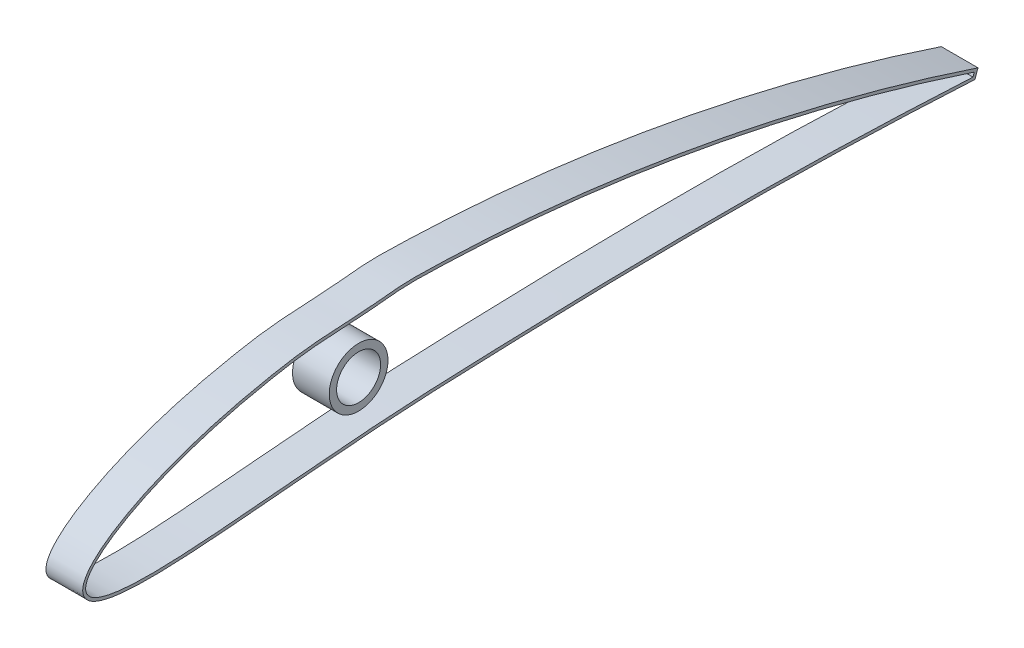
ISO-10303-21;
HEADER;
FILE_DESCRIPTION(('STEP AP214'),'2;1');
FILE_NAME('part.step','',(''),(''),'','','');
FILE_SCHEMA(('AUTOMOTIVE_DESIGN { 1 0 10303 214 1 1 1 1 }'));
ENDSEC;
DATA;
#1=APPLICATION_CONTEXT('core data for automotive mechanical design processes');
#2=APPLICATION_PROTOCOL_DEFINITION('international standard','automotive_design',2000,#1);
#3=PRODUCT_CONTEXT('',#1,'mechanical');
#4=PRODUCT('Part','Part','',(#3));
#5=PRODUCT_RELATED_PRODUCT_CATEGORY('part','',(#4));
#6=PRODUCT_DEFINITION_FORMATION('','',#4);
#7=PRODUCT_DEFINITION_CONTEXT('part definition',#1,'design');
#8=PRODUCT_DEFINITION('design','',#6,#7);
#9=PRODUCT_DEFINITION_SHAPE('','',#8);
#10=(LENGTH_UNIT() NAMED_UNIT(*) SI_UNIT(.MILLI.,.METRE.));
#11=(NAMED_UNIT(*) PLANE_ANGLE_UNIT() SI_UNIT($,.RADIAN.));
#12=(NAMED_UNIT(*) SI_UNIT($,.STERADIAN.) SOLID_ANGLE_UNIT());
#13=UNCERTAINTY_MEASURE_WITH_UNIT(LENGTH_MEASURE(1.E-05),#10,'distance_accuracy_value','');
#14=(GEOMETRIC_REPRESENTATION_CONTEXT(3) GLOBAL_UNCERTAINTY_ASSIGNED_CONTEXT((#13)) GLOBAL_UNIT_ASSIGNED_CONTEXT((#10,
#11,#12)) REPRESENTATION_CONTEXT('',''));
#15=CARTESIAN_POINT('',(0.,0.,0.));
#16=DIRECTION('',(0.,0.,1.));
#17=DIRECTION('',(1.,0.,0.));
#18=AXIS2_PLACEMENT_3D('',#15,#16,#17);
#19=CARTESIAN_POINT('',(5.,13.8316382788743,0.));
#20=DIRECTION('',(1.,0.,0.));
#21=DIRECTION('',(0.,0.,-1.));
#22=AXIS2_PLACEMENT_3D('',#19,#20,#21);
#23=PLANE('',#22);
#24=CARTESIAN_POINT('',(5.,13.8316382788743,0.));
#25=DIRECTION('',(1.,0.,0.));
#26=DIRECTION('',(0.,0.,-1.));
#27=AXIS2_PLACEMENT_3D('',#24,#25,#26);
#28=CIRCLE('',#27,8.);
#29=CARTESIAN_POINT('',(5.,13.8316382788743,-8.));
#30=VERTEX_POINT('',#29);
#31=EDGE_CURVE('E11',#30,#30,#28,.T.);
#32=ORIENTED_EDGE('',*,*,#31,.T.);
#33=EDGE_LOOP('',(#32));
#34=FACE_BOUND('',#33,.T.);
#35=CARTESIAN_POINT('',(5.,13.8316382788743,0.));
#36=DIRECTION('',(1.,0.,0.));
#37=DIRECTION('',(0.,0.,-1.));
#38=AXIS2_PLACEMENT_3D('',#35,#36,#37);
#39=CIRCLE('',#38,6.);
#40=CARTESIAN_POINT('',(5.,13.8316382788743,-6.));
#41=VERTEX_POINT('',#40);
#42=EDGE_CURVE('E58',#41,#41,#39,.T.);
#43=ORIENTED_EDGE('',*,*,#42,.F.);
#44=EDGE_LOOP('',(#43));
#45=FACE_BOUND('',#44,.T.);
#46=ADVANCED_FACE('F47',(#34,#45),#23,.T.);
#47=CARTESIAN_POINT('',(-5.,13.8316382788743,0.));
#48=DIRECTION('',(1.,0.,0.));
#49=DIRECTION('',(0.,0.,-1.));
#50=AXIS2_PLACEMENT_3D('',#47,#48,#49);
#51=PLANE('',#50);
#52=CARTESIAN_POINT('',(-5.,13.8316382788743,0.));
#53=DIRECTION('',(1.,0.,0.));
#54=DIRECTION('',(0.,0.,-1.));
#55=AXIS2_PLACEMENT_3D('',#52,#53,#54);
#56=CIRCLE('',#55,8.);
#57=CARTESIAN_POINT('',(-5.,13.8316382788743,-8.));
#58=VERTEX_POINT('',#57);
#59=EDGE_CURVE('E51',#58,#58,#56,.T.);
#60=ORIENTED_EDGE('',*,*,#59,.F.);
#61=EDGE_LOOP('',(#60));
#62=FACE_BOUND('',#61,.T.);
#63=CARTESIAN_POINT('',(-5.,13.8316382788743,0.));
#64=DIRECTION('',(1.,0.,0.));
#65=DIRECTION('',(0.,0.,-1.));
#66=AXIS2_PLACEMENT_3D('',#63,#64,#65);
#67=CIRCLE('',#66,6.);
#68=CARTESIAN_POINT('',(-5.,13.8316382788743,-6.));
#69=VERTEX_POINT('',#68);
#70=EDGE_CURVE('E60',#69,#69,#67,.T.);
#71=ORIENTED_EDGE('',*,*,#70,.T.);
#72=EDGE_LOOP('',(#71));
#73=FACE_BOUND('',#72,.T.);
#74=ADVANCED_FACE('F70',(#62,#73),#51,.F.);
#75=CARTESIAN_POINT('',(5.,13.8316382788743,0.));
#76=DIRECTION('',(-1.,0.,0.));
#77=DIRECTION('',(0.,0.,1.));
#78=AXIS2_PLACEMENT_3D('',#75,#76,#77);
#79=CYLINDRICAL_SURFACE('',#78,8.);
#80=ORIENTED_EDGE('',*,*,#31,.F.);
#81=EDGE_LOOP('',(#80));
#82=FACE_BOUND('',#81,.T.);
#83=ORIENTED_EDGE('',*,*,#59,.T.);
#84=EDGE_LOOP('',(#83));
#85=FACE_BOUND('',#84,.T.);
#86=ADVANCED_FACE('F49',(#82,#85),#79,.T.);
#87=CARTESIAN_POINT('',(5.,13.8316382788743,0.));
#88=DIRECTION('',(-1.,0.,0.));
#89=DIRECTION('',(0.,0.,1.));
#90=AXIS2_PLACEMENT_3D('',#87,#88,#89);
#91=CYLINDRICAL_SURFACE('',#90,6.);
#92=ORIENTED_EDGE('',*,*,#42,.T.);
#93=EDGE_LOOP('',(#92));
#94=FACE_BOUND('',#93,.T.);
#95=ORIENTED_EDGE('',*,*,#70,.F.);
#96=EDGE_LOOP('',(#95));
#97=FACE_BOUND('',#96,.T.);
#98=ADVANCED_FACE('F66',(#94,#97),#91,.F.);
#99=CLOSED_SHELL('',(#46,#74,#86,#98));
#100=MANIFOLD_SOLID_BREP('B2',#99);
#101=CARTESIAN_POINT('',(5.,4.91072843607201,73.6360322016632));
#102=DIRECTION('',(1.,0.,0.));
#103=DIRECTION('',(0.,0.,-1.));
#104=AXIS2_PLACEMENT_3D('',#101,#102,#103);
#105=PLANE('',#104);
#106=CARTESIAN_POINT('',(5.,0.31,-175.0625));
#107=CARTESIAN_POINT('',(5.,0.386656785260867,-174.839996683292));
#108=CARTESIAN_POINT('',(5.,0.692080587777158,-173.95347621638));
#109=CARTESIAN_POINT('',(5.,1.37693160672437,-171.969045378826));
#110=CARTESIAN_POINT('',(5.,2.48186756617926,-168.678388078185));
#111=CARTESIAN_POINT('',(5.,3.98615448049708,-164.116243722534));
#112=CARTESIAN_POINT('',(5.,5.82808273942373,-158.321527553603));
#113=CARTESIAN_POINT('',(5.,7.95021745611776,-151.348387177405));
#114=CARTESIAN_POINT('',(5.,10.2860485290555,-143.265278657669));
#115=CARTESIAN_POINT('',(5.,12.7620632427663,-134.149889827883));
#116=CARTESIAN_POINT('',(5.,15.3035732670121,-124.094059073488));
#117=CARTESIAN_POINT('',(5.,17.8302348409917,-113.198829774133));
#118=CARTESIAN_POINT('',(5.,20.2785668839539,-101.580770479168));
#119=CARTESIAN_POINT('',(5.,22.5695219280374,-89.3611503091119));
#120=CARTESIAN_POINT('',(5.,24.6347860462013,-76.671815162578));
#121=CARTESIAN_POINT('',(5.,26.4243257341982,-63.6518412734611));
#122=CARTESIAN_POINT('',(5.,27.8669812539859,-50.448474038204));
#123=CARTESIAN_POINT('',(5.,28.9683643851081,-37.1997856486568));
#124=CARTESIAN_POINT('',(5.,29.5516497826107,-23.978890102635));
#125=CARTESIAN_POINT('',(5.,29.9928279637515,-12.8789455396828));
#126=CARTESIAN_POINT('',(5.,28.4162874901109,-0.225940681675751));
#127=CARTESIAN_POINT('',(5.,28.3027061320454,11.9981247611921));
#128=CARTESIAN_POINT('',(5.,25.8794750281537,25.3047580659682));
#129=CARTESIAN_POINT('',(5.,23.5488716172235,35.750397981187));
#130=CARTESIAN_POINT('',(5.,20.7791852664084,45.1453054929548));
#131=CARTESIAN_POINT('',(5.,17.7632283875444,53.3851458134125));
#132=CARTESIAN_POINT('',(5.,14.6070836510975,60.3799835507161));
#133=CARTESIAN_POINT('',(5.,11.4359490336802,66.0638658873568));
#134=CARTESIAN_POINT('',(5.,8.36111311796748,70.4114997936221));
#135=CARTESIAN_POINT('',(5.,5.44958183899243,73.3995946615174));
#136=CARTESIAN_POINT('',(5.,2.69217537435382,75.1196130316748));
#137=CARTESIAN_POINT('',(5.,-0.0830568288830233,75.2755360395156));
#138=CARTESIAN_POINT('',(5.,-2.30644458837641,73.6304277510053));
#139=CARTESIAN_POINT('',(5.,-3.6987043502532,70.7464320988722));
#140=CARTESIAN_POINT('',(5.,-4.61277340515389,66.7813205160206));
#141=CARTESIAN_POINT('',(5.,-5.09187818573173,61.6728874060982));
#142=CARTESIAN_POINT('',(5.,-5.18779389176593,55.4720396059178));
#143=CARTESIAN_POINT('',(5.,-4.9408225051102,48.2381350626571));
#144=CARTESIAN_POINT('',(5.,-4.41186499361148,40.0525884202407));
#145=CARTESIAN_POINT('',(5.,-3.66349522482707,30.9994604063317));
#146=CARTESIAN_POINT('',(5.,-2.78126207416732,21.1667844465205));
#147=CARTESIAN_POINT('',(5.,-1.84059283018541,10.6431665357282));
#148=CARTESIAN_POINT('',(5.,-0.923049069087868,-0.480224023122504));
#149=CARTESIAN_POINT('',(5.,-0.113920583164004,-12.1110309039517));
#150=CARTESIAN_POINT('',(5.,0.495797589085909,-24.2454119540012));
#151=CARTESIAN_POINT('',(5.,0.926465779538036,-36.775333526096));
#152=CARTESIAN_POINT('',(5.,1.37045783647937,-49.5695653357246));
#153=CARTESIAN_POINT('',(5.,1.72513445285629,-62.4055140911088));
#154=CARTESIAN_POINT('',(5.,1.98196997555852,-75.1399673003173));
#155=CARTESIAN_POINT('',(5.,2.12601866451467,-87.6371077311722));
#156=CARTESIAN_POINT('',(5.,2.15171851526051,-99.7593087902504));
#157=CARTESIAN_POINT('',(5.,2.06657585475351,-111.371446336036));
#158=CARTESIAN_POINT('',(5.,1.88994840008397,-122.34262060722));
#159=CARTESIAN_POINT('',(5.,1.62722099435414,-132.546289305261));
#160=CARTESIAN_POINT('',(5.,1.32419328355468,-141.862896274546));
#161=CARTESIAN_POINT('',(5.,0.985789617551022,-150.185971069723));
#162=CARTESIAN_POINT('',(5.,0.663480719507972,-157.39929897691));
#163=CARTESIAN_POINT('',(5.,0.321557293383861,-163.464247939159));
#164=CARTESIAN_POINT('',(5.,0.156011837833149,-168.169094967301));
#165=CARTESIAN_POINT('',(5.,-0.264600132609582,-171.792401434852));
#166=CARTESIAN_POINT('',(5.,-0.00360922454095002,-173.588019013291));
#167=CARTESIAN_POINT('',(5.,-0.512024459386848,-174.969956533834));
#168=CARTESIAN_POINT('',(5.,-0.121175105151697,-174.992889948703));
#169=CARTESIAN_POINT('',(5.,0.,-175.));
#170=B_SPLINE_CURVE_WITH_KNOTS('',3,(#106,#107,#108,#109,#110,#111,#112,#113,#114,#115,#116,
#117,#118,#119,#120,#121,#122,#123,#124,#125,#126,#127,#128,#129,#130,#131,#132,#133,#134,#135,
#136,#137,#138,#139,#140,#141,#142,#143,#144,#145,#146,#147,#148,#149,#150,#151,#152,#153,#154,
#155,#156,#157,#158,#159,#160,#161,#162,#163,#164,#165,#166,#167,#168,#169),.UNSPECIFIED.,.F.,
.F.,(4,1,1,1,1,1,1,1,1,1,1,1,1,1,1,1,1,1,1,1,1,1,1,1,1,1,1,1,1,1,1,1,1,1,1,1,1,1,1,1,1,1,1,1,1,
1,1,1,1,1,1,1,1,1,1,1,1,1,1,1,1,4),(0.,0.00137159982353592,0.00546486827238331,
0.0122350087866554,0.0216023346361667,0.0334619105252101,0.0476720560542159,0.0640824019029862,
0.0824976564594881,0.102720886055692,0.124529185378068,0.147678146111302,0.171915480259503,
0.196981711231999,0.222600677217212,0.248500969688422,0.274389741692461,0.300046253138756,
0.325695496522466,0.338902544578221,0.374269119954373,0.396701049898539,0.417566883180145,
0.436644477619891,0.45373515050618,0.468671007323563,0.481320642605473,0.491622103601019,
0.49960732516459,0.505537918109396,0.510176699852202,0.514815987539965,0.52069340159554,
0.528508065165911,0.538457945436573,0.550535007300498,0.564635892926669,0.580631046199398,
0.598338082879752,0.617577990290096,0.63816828097447,0.659916337984438,0.682626745271016,
0.706115694837906,0.730722828546875,0.755696111536,0.78072806013092,0.805561174337463,
0.829929519360312,0.853567815504795,0.876211011450909,0.897608254735788,0.917517998468495,
0.935697259633792,0.951941865265304,0.96604658458157,0.977839565164238,0.987173784764013,
0.993931398238995,0.998018365920932,0.99938563358158,1.),.UNSPECIFIED.);
#171=CARTESIAN_POINT('',(5.,2.46412374991865,-168.719684670635));
#172=VERTEX_POINT('',#171);
#173=CARTESIAN_POINT('',(5.,0.117538895541075,-167.911154676725));
#174=VERTEX_POINT('',#173);
#175=EDGE_CURVE('E202',#172,#174,#170,.T.);
#176=ORIENTED_EDGE('',*,*,#175,.T.);
#177=DIRECTION('',(0.,0.945452073645023,-0.32576122611558));
#178=VECTOR('',#177,1.);
#179=CARTESIAN_POINT('',(5.,2.46412374991865,-168.719684670635));
#180=LINE('',#179,#178);
#181=EDGE_CURVE('E206',#174,#172,#180,.T.);
#182=ORIENTED_EDGE('',*,*,#181,.T.);
#183=EDGE_LOOP('',(#176,#182));
#184=FACE_BOUND('',#183,.T.);
#185=DIRECTION('',(0.,0.945452073647457,-0.325761226108516));
#186=VECTOR('',#185,1.);
#187=CARTESIAN_POINT('',(5.,1.95981081220781,-167.699764541602));
#188=LINE('',#187,#186);
#189=CARTESIAN_POINT('',(5.,0.95583245375809,-167.353837730343));
#190=VERTEX_POINT('',#189);
#191=CARTESIAN_POINT('',(5.,1.95981081220781,-167.699764541602));
#192=VERTEX_POINT('',#191);
#193=EDGE_CURVE('E158',#190,#192,#188,.T.);
#194=ORIENTED_EDGE('',*,*,#193,.F.);
#195=CARTESIAN_POINT('',(5.,1.95981081220781,-167.699764541602));
#196=CARTESIAN_POINT('',(5.,5.22651096355477,-157.841528871778));
#197=CARTESIAN_POINT('',(5.,11.1978834715807,-137.934402672952));
#198=CARTESIAN_POINT('',(5.,18.4739231597176,-107.6223014336));
#199=CARTESIAN_POINT('',(5.,23.1158200662538,-82.0630185120686));
#200=CARTESIAN_POINT('',(5.,25.5568406341146,-64.0507852880274));
#201=CARTESIAN_POINT('',(5.,26.698413453929,-53.7292230884738));
#202=CARTESIAN_POINT('',(5.,27.4379228730115,-45.9730543424357));
#203=CARTESIAN_POINT('',(5.,28.0457074595212,-38.2099704857563));
#204=CARTESIAN_POINT('',(5.,28.4678509227489,-30.445060378047));
#205=CARTESIAN_POINT('',(5.,28.8092674640242,-22.6426167207629));
#206=CARTESIAN_POINT('',(5.,29.0299078515394,-16.1581108770053));
#207=CARTESIAN_POINT('',(5.,28.8601579320575,-11.0274700431948));
#208=CARTESIAN_POINT('',(5.,28.4817050272508,-7.1867194194313));
#209=CARTESIAN_POINT('',(5.,28.0655497324937,-3.27933886456512));
#210=CARTESIAN_POINT('',(5.,27.7058571843799,1.9394545171047));
#211=CARTESIAN_POINT('',(5.,27.4034368275221,8.43870608441734));
#212=CARTESIAN_POINT('',(5.,26.7104373681169,16.1308523928607));
#213=CARTESIAN_POINT('',(5.,25.3332493600311,23.7748192175605));
#214=CARTESIAN_POINT('',(5.,23.7254501123752,31.3944574295668));
#215=CARTESIAN_POINT('',(5.,21.8165559786629,38.9138042853256));
#216=CARTESIAN_POINT('',(5.,19.5078821378487,46.3297893717538));
#217=CARTESIAN_POINT('',(5.,16.8001448961901,53.5975458809131));
#218=CARTESIAN_POINT('',(5.,14.1302881385722,59.4770242475435));
#219=CARTESIAN_POINT('',(5.,11.6735248556258,63.9978114854174));
#220=CARTESIAN_POINT('',(5.,9.63214622668094,67.2658588599865));
#221=CARTESIAN_POINT('',(5.,7.33922526815957,70.3241236398973));
#222=CARTESIAN_POINT('',(5.,5.12198758091913,72.5656392001527));
#223=CARTESIAN_POINT('',(5.,3.35008193327919,73.7583960091683));
#224=CARTESIAN_POINT('',(5.,2.30009452609174,74.1832481204688));
#225=CARTESIAN_POINT('',(5.,1.47019423193252,74.3583469903471));
#226=CARTESIAN_POINT('',(5.,0.652419618675903,74.3566970910472));
#227=CARTESIAN_POINT('',(5.,-0.297543453849162,74.1034043849272));
#228=CARTESIAN_POINT('',(5.,-1.43105231715242,73.2331592735354));
#229=CARTESIAN_POINT('',(5.,-2.34452826999686,71.7617592101625));
#230=CARTESIAN_POINT('',(5.,-3.21199023631053,69.420692003721));
#231=CARTESIAN_POINT('',(5.,-3.83640907230191,66.3275701332473));
#232=CARTESIAN_POINT('',(5.,-4.2053195900544,62.4984587489129));
#233=CARTESIAN_POINT('',(5.,-4.34779716987375,58.6349820932204));
#234=CARTESIAN_POINT('',(5.,-4.34013110305141,54.7590797181356));
#235=CARTESIAN_POINT('',(5.,-4.19273414975697,49.5838150298395));
#236=CARTESIAN_POINT('',(5.,-3.82498905857467,43.1094155262818));
#237=CARTESIAN_POINT('',(5.,-3.22845284308392,35.3426252640675));
#238=CARTESIAN_POINT('',(5.,-2.55430214630124,27.5749049976324));
#239=CARTESIAN_POINT('',(5.,-1.62224739973353,17.2160528823046));
#240=CARTESIAN_POINT('',(5.,-0.479857669979027,4.25796913954655));
#241=CARTESIAN_POINT('',(5.,0.670285330431052,-11.3197019929177));
#242=CARTESIAN_POINT('',(5.,1.40947737106585,-26.9283713971026));
#243=CARTESIAN_POINT('',(5.,1.92810076013211,-42.5213331791508));
#244=CARTESIAN_POINT('',(5.,2.42870808098584,-58.1234981406694));
#245=CARTESIAN_POINT('',(5.,2.88102421390314,-78.9323058800137));
#246=CARTESIAN_POINT('',(5.,3.00786265493585,-99.7497881747633));
#247=CARTESIAN_POINT('',(5.,2.74279684512756,-120.566269014412));
#248=CARTESIAN_POINT('',(5.,2.33921624146495,-136.172178707223));
#249=CARTESIAN_POINT('',(5.,1.88878861027151,-147.877534908716));
#250=CARTESIAN_POINT('',(5.,1.54038724842847,-155.668345508073));
#251=CARTESIAN_POINT('',(5.,1.3401943722453,-159.578889619721));
#252=CARTESIAN_POINT('',(5.,1.16530918996537,-162.829008951013));
#253=CARTESIAN_POINT('',(5.,1.05880448979736,-165.390438596536));
#254=CARTESIAN_POINT('',(5.,0.995790978655862,-166.702333121523));
#255=CARTESIAN_POINT('',(5.,0.955832453758093,-167.353837730343));
#256=B_SPLINE_CURVE_WITH_KNOTS('',3,(#195,#196,#197,#198,#199,#200,#201,#202,#203,#204,#205,
#206,#207,#208,#209,#210,#211,#212,#213,#214,#215,#216,#217,#218,#219,#220,#221,#222,#223,#224,
#225,#226,#227,#228,#229,#230,#231,#232,#233,#234,#235,#236,#237,#238,#239,#240,#241,#242,#243,
#244,#245,#246,#247,#248,#249,#250,#251,#252,#253,#254,#255),.UNSPECIFIED.,.F.,.F.,(4,1,1,1,1,1,
1,1,1,1,1,1,1,1,1,1,1,1,1,1,1,1,1,1,1,1,1,1,1,1,1,1,1,1,1,1,1,1,1,1,1,1,1,1,1,1,1,1,1,1,1,1,1,1,
1,1,1,1,4),(0.0145864090500207,0.0752100578959077,0.135833706741795,0.196457355587682,
0.226769180010625,0.241925092222097,0.257081004433569,0.272236916645041,0.287392828856513,
0.302548741067984,0.317704653279456,0.325282609385192,0.332860565490928,0.340438521596664,
0.3480164777024,0.363172389913871,0.378328302125343,0.393484214336815,0.408640126548287,
0.423796038759758,0.43895195097123,0.454107863182702,0.469263775394174,0.47684173149991,
0.484419687605646,0.491997643711381,0.499575599817117,0.503364577869985,0.505259066896419,
0.507153555922853,0.509048044949287,0.510942533975721,0.514731512028589,0.518520490081457,
0.522309468134325,0.529887424240061,0.537465380345797,0.545043336451533,0.552621292557268,
0.560199248663004,0.575355160874476,0.590511073085948,0.60566698529742,0.620822897508891,
0.651134721931835,0.681446546354779,0.711758370777722,0.742070195200666,0.772382019623609,
0.802693844046553,0.86331749289244,0.893629317315383,0.923941141738327,0.95425296616127,
0.961830922267006,0.969408878372742,0.976986834478478,0.980775812531346,0.984564790584214),.UNSPECIFIED.);
#257=EDGE_CURVE('E164',#192,#190,#256,.T.);
#258=ORIENTED_EDGE('',*,*,#257,.F.);
#259=EDGE_LOOP('',(#194,#258));
#260=FACE_BOUND('',#259,.T.);
#261=ADVANCED_FACE('F117',(#184,#260),#105,.T.);
#262=CARTESIAN_POINT('',(-5.,4.91072843607201,73.6360322016632));
#263=DIRECTION('',(1.,0.,0.));
#264=DIRECTION('',(0.,0.,-1.));
#265=AXIS2_PLACEMENT_3D('',#262,#263,#264);
#266=PLANE('',#265);
#267=CARTESIAN_POINT('',(-5.,0.31,-175.0625));
#268=CARTESIAN_POINT('',(-5.,0.386656785260867,-174.839996683292));
#269=CARTESIAN_POINT('',(-5.,0.692080587777158,-173.95347621638));
#270=CARTESIAN_POINT('',(-5.,1.37693160672437,-171.969045378826));
#271=CARTESIAN_POINT('',(-5.,2.48186756617926,-168.678388078185));
#272=CARTESIAN_POINT('',(-5.,3.98615448049708,-164.116243722534));
#273=CARTESIAN_POINT('',(-5.,5.82808273942373,-158.321527553603));
#274=CARTESIAN_POINT('',(-5.,7.95021745611776,-151.348387177405));
#275=CARTESIAN_POINT('',(-5.,10.2860485290555,-143.265278657669));
#276=CARTESIAN_POINT('',(-5.,12.7620632427663,-134.149889827883));
#277=CARTESIAN_POINT('',(-5.,15.3035732670121,-124.094059073488));
#278=CARTESIAN_POINT('',(-5.,17.8302348409917,-113.198829774133));
#279=CARTESIAN_POINT('',(-5.,20.2785668839539,-101.580770479168));
#280=CARTESIAN_POINT('',(-5.,22.5695219280374,-89.3611503091119));
#281=CARTESIAN_POINT('',(-5.,24.6347860462013,-76.671815162578));
#282=CARTESIAN_POINT('',(-5.,26.4243257341982,-63.6518412734611));
#283=CARTESIAN_POINT('',(-5.,27.8669812539859,-50.448474038204));
#284=CARTESIAN_POINT('',(-5.,28.9683643851081,-37.1997856486568));
#285=CARTESIAN_POINT('',(-5.,29.5516497826107,-23.978890102635));
#286=CARTESIAN_POINT('',(-5.,29.9928279637515,-12.8789455396828));
#287=CARTESIAN_POINT('',(-5.,28.4162874901109,-0.225940681675751));
#288=CARTESIAN_POINT('',(-5.,28.3027061320454,11.9981247611921));
#289=CARTESIAN_POINT('',(-5.,25.8794750281537,25.3047580659682));
#290=CARTESIAN_POINT('',(-5.,23.5488716172235,35.750397981187));
#291=CARTESIAN_POINT('',(-5.,20.7791852664084,45.1453054929548));
#292=CARTESIAN_POINT('',(-5.,17.7632283875444,53.3851458134125));
#293=CARTESIAN_POINT('',(-5.,14.6070836510975,60.3799835507161));
#294=CARTESIAN_POINT('',(-5.,11.4359490336802,66.0638658873568));
#295=CARTESIAN_POINT('',(-5.,8.36111311796748,70.4114997936221));
#296=CARTESIAN_POINT('',(-5.,5.44958183899243,73.3995946615174));
#297=CARTESIAN_POINT('',(-5.,2.69217537435382,75.1196130316748));
#298=CARTESIAN_POINT('',(-5.,-0.0830568288830233,75.2755360395156));
#299=CARTESIAN_POINT('',(-5.,-2.30644458837641,73.6304277510053));
#300=CARTESIAN_POINT('',(-5.,-3.6987043502532,70.7464320988722));
#301=CARTESIAN_POINT('',(-5.,-4.61277340515389,66.7813205160206));
#302=CARTESIAN_POINT('',(-5.,-5.09187818573173,61.6728874060982));
#303=CARTESIAN_POINT('',(-5.,-5.18779389176593,55.4720396059178));
#304=CARTESIAN_POINT('',(-5.,-4.9408225051102,48.2381350626571));
#305=CARTESIAN_POINT('',(-5.,-4.41186499361148,40.0525884202407));
#306=CARTESIAN_POINT('',(-5.,-3.66349522482707,30.9994604063317));
#307=CARTESIAN_POINT('',(-5.,-2.78126207416732,21.1667844465205));
#308=CARTESIAN_POINT('',(-5.,-1.84059283018541,10.6431665357282));
#309=CARTESIAN_POINT('',(-5.,-0.923049069087868,-0.480224023122504));
#310=CARTESIAN_POINT('',(-5.,-0.113920583164004,-12.1110309039517));
#311=CARTESIAN_POINT('',(-5.,0.495797589085909,-24.2454119540012));
#312=CARTESIAN_POINT('',(-5.,0.926465779538036,-36.775333526096));
#313=CARTESIAN_POINT('',(-5.,1.37045783647937,-49.5695653357246));
#314=CARTESIAN_POINT('',(-5.,1.72513445285629,-62.4055140911088));
#315=CARTESIAN_POINT('',(-5.,1.98196997555852,-75.1399673003173));
#316=CARTESIAN_POINT('',(-5.,2.12601866451467,-87.6371077311722));
#317=CARTESIAN_POINT('',(-5.,2.15171851526051,-99.7593087902504));
#318=CARTESIAN_POINT('',(-5.,2.06657585475351,-111.371446336036));
#319=CARTESIAN_POINT('',(-5.,1.88994840008397,-122.34262060722));
#320=CARTESIAN_POINT('',(-5.,1.62722099435414,-132.546289305261));
#321=CARTESIAN_POINT('',(-5.,1.32419328355468,-141.862896274546));
#322=CARTESIAN_POINT('',(-5.,0.985789617551022,-150.185971069723));
#323=CARTESIAN_POINT('',(-5.,0.663480719507972,-157.39929897691));
#324=CARTESIAN_POINT('',(-5.,0.321557293383861,-163.464247939159));
#325=CARTESIAN_POINT('',(-5.,0.156011837833149,-168.169094967301));
#326=CARTESIAN_POINT('',(-5.,-0.264600132609582,-171.792401434852));
#327=CARTESIAN_POINT('',(-5.,-0.00360922454095002,-173.588019013291));
#328=CARTESIAN_POINT('',(-5.,-0.512024459386848,-174.969956533834));
#329=CARTESIAN_POINT('',(-5.,-0.121175105151697,-174.992889948703));
#330=CARTESIAN_POINT('',(-5.,0.,-175.));
#331=B_SPLINE_CURVE_WITH_KNOTS('',3,(#267,#268,#269,#270,#271,#272,#273,#274,#275,#276,#277,
#278,#279,#280,#281,#282,#283,#284,#285,#286,#287,#288,#289,#290,#291,#292,#293,#294,#295,#296,
#297,#298,#299,#300,#301,#302,#303,#304,#305,#306,#307,#308,#309,#310,#311,#312,#313,#314,#315,
#316,#317,#318,#319,#320,#321,#322,#323,#324,#325,#326,#327,#328,#329,#330),.UNSPECIFIED.,.F.,
.F.,(4,1,1,1,1,1,1,1,1,1,1,1,1,1,1,1,1,1,1,1,1,1,1,1,1,1,1,1,1,1,1,1,1,1,1,1,1,1,1,1,1,1,1,1,1,
1,1,1,1,1,1,1,1,1,1,1,1,1,1,1,1,4),(0.,0.00137159982353592,0.00546486827238331,
0.0122350087866554,0.0216023346361667,0.0334619105252101,0.0476720560542159,0.0640824019029862,
0.0824976564594881,0.102720886055692,0.124529185378068,0.147678146111302,0.171915480259503,
0.196981711231999,0.222600677217212,0.248500969688422,0.274389741692461,0.300046253138756,
0.325695496522466,0.338902544578221,0.374269119954373,0.396701049898539,0.417566883180145,
0.436644477619891,0.45373515050618,0.468671007323563,0.481320642605473,0.491622103601019,
0.49960732516459,0.505537918109396,0.510176699852202,0.514815987539965,0.52069340159554,
0.528508065165911,0.538457945436573,0.550535007300498,0.564635892926669,0.580631046199398,
0.598338082879752,0.617577990290096,0.63816828097447,0.659916337984438,0.682626745271016,
0.706115694837906,0.730722828546875,0.755696111536,0.78072806013092,0.805561174337463,
0.829929519360312,0.853567815504795,0.876211011450909,0.897608254735788,0.917517998468495,
0.935697259633792,0.951941865265304,0.96604658458157,0.977839565164238,0.987173784764013,
0.993931398238995,0.998018365920932,0.99938563358158,1.),.UNSPECIFIED.);
#332=CARTESIAN_POINT('',(-5.,2.46412374991865,-168.719684670635));
#333=VERTEX_POINT('',#332);
#334=CARTESIAN_POINT('',(-5.,0.117538895541075,-167.911154676725));
#335=VERTEX_POINT('',#334);
#336=EDGE_CURVE('E203',#333,#335,#331,.T.);
#337=ORIENTED_EDGE('',*,*,#336,.F.);
#338=DIRECTION('',(0.,0.945452073645023,-0.32576122611558));
#339=VECTOR('',#338,1.);
#340=CARTESIAN_POINT('',(-5.,2.46412374991865,-168.719684670635));
#341=LINE('',#340,#339);
#342=EDGE_CURVE('E196',#335,#333,#341,.T.);
#343=ORIENTED_EDGE('',*,*,#342,.F.);
#344=EDGE_LOOP('',(#337,#343));
#345=FACE_BOUND('',#344,.T.);
#346=CARTESIAN_POINT('',(-5.,1.95981081220781,-167.699764541602));
#347=CARTESIAN_POINT('',(-5.,5.22651096355477,-157.841528871778));
#348=CARTESIAN_POINT('',(-5.,11.1978834715807,-137.934402672952));
#349=CARTESIAN_POINT('',(-5.,18.4739231597176,-107.6223014336));
#350=CARTESIAN_POINT('',(-5.,23.1158200662538,-82.0630185120686));
#351=CARTESIAN_POINT('',(-5.,25.5568406341146,-64.0507852880274));
#352=CARTESIAN_POINT('',(-5.,26.698413453929,-53.7292230884738));
#353=CARTESIAN_POINT('',(-5.,27.4379228730115,-45.9730543424357));
#354=CARTESIAN_POINT('',(-5.,28.0457074595212,-38.2099704857563));
#355=CARTESIAN_POINT('',(-5.,28.4678509227489,-30.445060378047));
#356=CARTESIAN_POINT('',(-5.,28.8092674640242,-22.6426167207629));
#357=CARTESIAN_POINT('',(-5.,29.0299078515394,-16.1581108770053));
#358=CARTESIAN_POINT('',(-5.,28.8601579320575,-11.0274700431948));
#359=CARTESIAN_POINT('',(-5.,28.4817050272508,-7.1867194194313));
#360=CARTESIAN_POINT('',(-5.,28.0655497324937,-3.27933886456512));
#361=CARTESIAN_POINT('',(-5.,27.7058571843799,1.9394545171047));
#362=CARTESIAN_POINT('',(-5.,27.4034368275221,8.43870608441734));
#363=CARTESIAN_POINT('',(-5.,26.7104373681169,16.1308523928607));
#364=CARTESIAN_POINT('',(-5.,25.3332493600311,23.7748192175605));
#365=CARTESIAN_POINT('',(-5.,23.7254501123752,31.3944574295668));
#366=CARTESIAN_POINT('',(-5.,21.8165559786629,38.9138042853256));
#367=CARTESIAN_POINT('',(-5.,19.5078821378487,46.3297893717538));
#368=CARTESIAN_POINT('',(-5.,16.8001448961901,53.5975458809131));
#369=CARTESIAN_POINT('',(-5.,14.1302881385722,59.4770242475435));
#370=CARTESIAN_POINT('',(-5.,11.6735248556258,63.9978114854174));
#371=CARTESIAN_POINT('',(-5.,9.63214622668094,67.2658588599865));
#372=CARTESIAN_POINT('',(-5.,7.33922526815957,70.3241236398973));
#373=CARTESIAN_POINT('',(-5.,5.12198758091913,72.5656392001527));
#374=CARTESIAN_POINT('',(-5.,3.35008193327919,73.7583960091683));
#375=CARTESIAN_POINT('',(-5.,2.30009452609174,74.1832481204688));
#376=CARTESIAN_POINT('',(-5.,1.47019423193252,74.3583469903471));
#377=CARTESIAN_POINT('',(-5.,0.652419618675903,74.3566970910472));
#378=CARTESIAN_POINT('',(-5.,-0.297543453849162,74.1034043849272));
#379=CARTESIAN_POINT('',(-5.,-1.43105231715242,73.2331592735354));
#380=CARTESIAN_POINT('',(-5.,-2.34452826999686,71.7617592101625));
#381=CARTESIAN_POINT('',(-5.,-3.21199023631053,69.420692003721));
#382=CARTESIAN_POINT('',(-5.,-3.83640907230191,66.3275701332473));
#383=CARTESIAN_POINT('',(-5.,-4.2053195900544,62.4984587489129));
#384=CARTESIAN_POINT('',(-5.,-4.34779716987375,58.6349820932204));
#385=CARTESIAN_POINT('',(-5.,-4.34013110305141,54.7590797181356));
#386=CARTESIAN_POINT('',(-5.,-4.19273414975697,49.5838150298395));
#387=CARTESIAN_POINT('',(-5.,-3.82498905857467,43.1094155262818));
#388=CARTESIAN_POINT('',(-5.,-3.22845284308392,35.3426252640675));
#389=CARTESIAN_POINT('',(-5.,-2.55430214630124,27.5749049976324));
#390=CARTESIAN_POINT('',(-5.,-1.62224739973353,17.2160528823046));
#391=CARTESIAN_POINT('',(-5.,-0.479857669979027,4.25796913954655));
#392=CARTESIAN_POINT('',(-5.,0.670285330431052,-11.3197019929177));
#393=CARTESIAN_POINT('',(-5.,1.40947737106585,-26.9283713971026));
#394=CARTESIAN_POINT('',(-5.,1.92810076013211,-42.5213331791508));
#395=CARTESIAN_POINT('',(-5.,2.42870808098584,-58.1234981406694));
#396=CARTESIAN_POINT('',(-5.,2.88102421390314,-78.9323058800137));
#397=CARTESIAN_POINT('',(-5.,3.00786265493585,-99.7497881747633));
#398=CARTESIAN_POINT('',(-5.,2.74279684512756,-120.566269014412));
#399=CARTESIAN_POINT('',(-5.,2.33921624146495,-136.172178707223));
#400=CARTESIAN_POINT('',(-5.,1.88878861027151,-147.877534908716));
#401=CARTESIAN_POINT('',(-5.,1.54038724842847,-155.668345508073));
#402=CARTESIAN_POINT('',(-5.,1.3401943722453,-159.578889619721));
#403=CARTESIAN_POINT('',(-5.,1.16530918996537,-162.829008951013));
#404=CARTESIAN_POINT('',(-5.,1.05880448979736,-165.390438596536));
#405=CARTESIAN_POINT('',(-5.,0.995790978655862,-166.702333121523));
#406=CARTESIAN_POINT('',(-5.,0.955832453758093,-167.353837730343));
#407=B_SPLINE_CURVE_WITH_KNOTS('',3,(#346,#347,#348,#349,#350,#351,#352,#353,#354,#355,#356,
#357,#358,#359,#360,#361,#362,#363,#364,#365,#366,#367,#368,#369,#370,#371,#372,#373,#374,#375,
#376,#377,#378,#379,#380,#381,#382,#383,#384,#385,#386,#387,#388,#389,#390,#391,#392,#393,#394,
#395,#396,#397,#398,#399,#400,#401,#402,#403,#404,#405,#406),.UNSPECIFIED.,.F.,.F.,(4,1,1,1,1,1,
1,1,1,1,1,1,1,1,1,1,1,1,1,1,1,1,1,1,1,1,1,1,1,1,1,1,1,1,1,1,1,1,1,1,1,1,1,1,1,1,1,1,1,1,1,1,1,1,
1,1,1,1,4),(0.0145864090500207,0.0752100578959077,0.135833706741795,0.196457355587682,
0.226769180010625,0.241925092222097,0.257081004433569,0.272236916645041,0.287392828856513,
0.302548741067984,0.317704653279456,0.325282609385192,0.332860565490928,0.340438521596664,
0.3480164777024,0.363172389913871,0.378328302125343,0.393484214336815,0.408640126548287,
0.423796038759758,0.43895195097123,0.454107863182702,0.469263775394174,0.47684173149991,
0.484419687605646,0.491997643711381,0.499575599817117,0.503364577869985,0.505259066896419,
0.507153555922853,0.509048044949287,0.510942533975721,0.514731512028589,0.518520490081457,
0.522309468134325,0.529887424240061,0.537465380345797,0.545043336451533,0.552621292557268,
0.560199248663004,0.575355160874476,0.590511073085948,0.60566698529742,0.620822897508891,
0.651134721931835,0.681446546354779,0.711758370777722,0.742070195200666,0.772382019623609,
0.802693844046553,0.86331749289244,0.893629317315383,0.923941141738327,0.95425296616127,
0.961830922267006,0.969408878372742,0.976986834478478,0.980775812531346,0.984564790584214),.UNSPECIFIED.);
#408=CARTESIAN_POINT('',(-5.,1.95981081220781,-167.699764541602));
#409=VERTEX_POINT('',#408);
#410=CARTESIAN_POINT('',(-5.,0.955832453758093,-167.353837730343));
#411=VERTEX_POINT('',#410);
#412=EDGE_CURVE('E140',#409,#411,#407,.T.);
#413=ORIENTED_EDGE('',*,*,#412,.T.);
#414=DIRECTION('',(0.,0.945452073647457,-0.325761226108516));
#415=VECTOR('',#414,1.);
#416=CARTESIAN_POINT('',(-5.,1.95981081220781,-167.699764541602));
#417=LINE('',#416,#415);
#418=EDGE_CURVE('E168',#411,#409,#417,.T.);
#419=ORIENTED_EDGE('',*,*,#418,.T.);
#420=EDGE_LOOP('',(#413,#419));
#421=FACE_BOUND('',#420,.T.);
#422=ADVANCED_FACE('F185',(#345,#421),#266,.F.);
#423=DIRECTION('',(-1.,0.,0.));
#424=VECTOR('',#423,1.);
#425=SURFACE_OF_LINEAR_EXTRUSION('',#170,#424);
#426=ORIENTED_EDGE('',*,*,#336,.T.);
#427=DIRECTION('',(-1.,0.,0.));
#428=VECTOR('',#427,1.);
#429=CARTESIAN_POINT('',(5.,0.117538895541075,-167.911154676725));
#430=LINE('',#429,#428);
#431=EDGE_CURVE('E45',#174,#335,#430,.T.);
#432=ORIENTED_EDGE('',*,*,#431,.F.);
#433=ORIENTED_EDGE('',*,*,#175,.F.);
#434=DIRECTION('',(-1.,0.,0.));
#435=VECTOR('',#434,1.);
#436=CARTESIAN_POINT('',(5.,2.46412374991865,-168.719684670635));
#437=LINE('',#436,#435);
#438=EDGE_CURVE('E126',#172,#333,#437,.T.);
#439=ORIENTED_EDGE('',*,*,#438,.T.);
#440=EDGE_LOOP('',(#426,#432,#433,#439));
#441=FACE_BOUND('',#440,.T.);
#442=ADVANCED_FACE('F119',(#441),#425,.F.);
#443=CARTESIAN_POINT('',(5.,2.46412374991865,-168.719684670635));
#444=DIRECTION('',(0.,0.32576122611558,0.945452073645023));
#445=DIRECTION('',(0.,-0.945452073645023,0.32576122611558));
#446=AXIS2_PLACEMENT_3D('',#443,#444,#445);
#447=PLANE('',#446);
#448=ORIENTED_EDGE('',*,*,#342,.T.);
#449=ORIENTED_EDGE('',*,*,#438,.F.);
#450=ORIENTED_EDGE('',*,*,#181,.F.);
#451=ORIENTED_EDGE('',*,*,#431,.T.);
#452=EDGE_LOOP('',(#448,#449,#450,#451));
#453=FACE_BOUND('',#452,.T.);
#454=ADVANCED_FACE('F182',(#453),#447,.F.);
#455=DIRECTION('',(-1.,0.,0.));
#456=VECTOR('',#455,1.);
#457=SURFACE_OF_LINEAR_EXTRUSION('',#256,#456);
#458=ORIENTED_EDGE('',*,*,#412,.F.);
#459=DIRECTION('',(-1.,0.,0.));
#460=VECTOR('',#459,1.);
#461=CARTESIAN_POINT('',(5.,1.95981081220781,-167.699764541602));
#462=LINE('',#461,#460);
#463=EDGE_CURVE('E160',#192,#409,#462,.T.);
#464=ORIENTED_EDGE('',*,*,#463,.F.);
#465=ORIENTED_EDGE('',*,*,#257,.T.);
#466=DIRECTION('',(-1.,0.,0.));
#467=VECTOR('',#466,1.);
#468=CARTESIAN_POINT('',(5.,0.955832453758093,-167.353837730343));
#469=LINE('',#468,#467);
#470=EDGE_CURVE('E133',#190,#411,#469,.T.);
#471=ORIENTED_EDGE('',*,*,#470,.T.);
#472=EDGE_LOOP('',(#458,#464,#465,#471));
#473=FACE_BOUND('',#472,.T.);
#474=ADVANCED_FACE('F166',(#473),#457,.T.);
#475=CARTESIAN_POINT('',(5.,1.95981081220781,-167.699764541602));
#476=DIRECTION('',(0.,0.325761226108516,0.945452073647457));
#477=DIRECTION('',(0.,-0.945452073647457,0.325761226108516));
#478=AXIS2_PLACEMENT_3D('',#475,#476,#477);
#479=PLANE('',#478);
#480=ORIENTED_EDGE('',*,*,#418,.F.);
#481=ORIENTED_EDGE('',*,*,#470,.F.);
#482=ORIENTED_EDGE('',*,*,#193,.T.);
#483=ORIENTED_EDGE('',*,*,#463,.T.);
#484=EDGE_LOOP('',(#480,#481,#482,#483));
#485=FACE_BOUND('',#484,.T.);
#486=ADVANCED_FACE('F159',(#485),#479,.T.);
#487=CLOSED_SHELL('',(#261,#422,#442,#454,#474,#486));
#488=MANIFOLD_SOLID_BREP('B6',#487);
#489=ADVANCED_BREP_SHAPE_REPRESENTATION('',(#18,#100,#488),#14);
#490=SHAPE_DEFINITION_REPRESENTATION(#9,#489);
ENDSEC;
END-ISO-10303-21;
